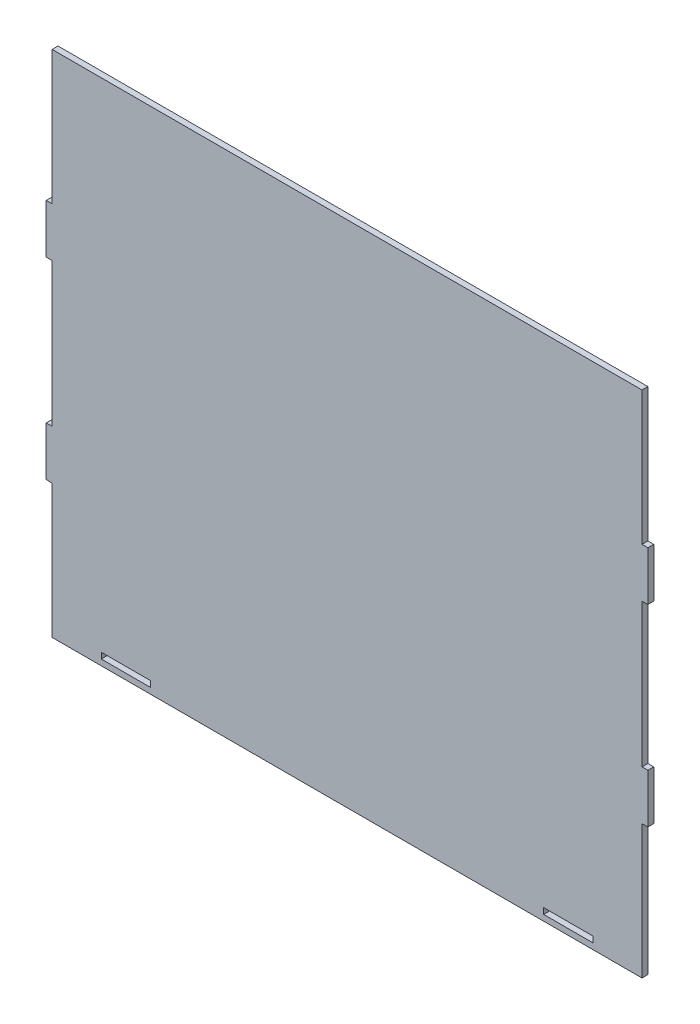
ISO-10303-21;
HEADER;
FILE_DESCRIPTION(('STEP AP214'),'2;1');
FILE_NAME('part.step','',(''),(''),'','','');
FILE_SCHEMA(('AUTOMOTIVE_DESIGN { 1 0 10303 214 1 1 1 1 }'));
ENDSEC;
DATA;
#1=APPLICATION_CONTEXT('core data for automotive mechanical design processes');
#2=APPLICATION_PROTOCOL_DEFINITION('international standard','automotive_design',2000,#1);
#3=PRODUCT_CONTEXT('',#1,'mechanical');
#4=PRODUCT('Part','Part','',(#3));
#5=PRODUCT_RELATED_PRODUCT_CATEGORY('part','',(#4));
#6=PRODUCT_DEFINITION_FORMATION('','',#4);
#7=PRODUCT_DEFINITION_CONTEXT('part definition',#1,'design');
#8=PRODUCT_DEFINITION('design','',#6,#7);
#9=PRODUCT_DEFINITION_SHAPE('','',#8);
#10=(LENGTH_UNIT() NAMED_UNIT(*) SI_UNIT(.MILLI.,.METRE.));
#11=(NAMED_UNIT(*) PLANE_ANGLE_UNIT() SI_UNIT($,.RADIAN.));
#12=(NAMED_UNIT(*) SI_UNIT($,.STERADIAN.) SOLID_ANGLE_UNIT());
#13=UNCERTAINTY_MEASURE_WITH_UNIT(LENGTH_MEASURE(1.E-05),#10,'distance_accuracy_value','');
#14=(GEOMETRIC_REPRESENTATION_CONTEXT(3) GLOBAL_UNCERTAINTY_ASSIGNED_CONTEXT((#13)) GLOBAL_UNIT_ASSIGNED_CONTEXT((#10,
#11,#12)) REPRESENTATION_CONTEXT('',''));
#15=CARTESIAN_POINT('',(0.,0.,0.));
#16=DIRECTION('',(0.,0.,1.));
#17=DIRECTION('',(1.,0.,0.));
#18=AXIS2_PLACEMENT_3D('',#15,#16,#17);
#19=CARTESIAN_POINT('',(0.,0.,6.));
#20=DIRECTION('',(0.,0.,1.));
#21=DIRECTION('',(1.,0.,0.));
#22=AXIS2_PLACEMENT_3D('',#19,#20,#21);
#23=PLANE('',#22);
#24=DIRECTION('',(0.,1.,0.));
#25=VECTOR('',#24,1.);
#26=CARTESIAN_POINT('',(300.,-123.,6.));
#27=LINE('',#26,#25);
#28=CARTESIAN_POINT('',(300.,-259.,6.));
#29=VERTEX_POINT('',#28);
#30=CARTESIAN_POINT('',(300.,-123.,6.));
#31=VERTEX_POINT('',#30);
#32=EDGE_CURVE('E285',#29,#31,#27,.T.);
#33=ORIENTED_EDGE('',*,*,#32,.T.);
#34=DIRECTION('',(1.,0.,0.));
#35=VECTOR('',#34,1.);
#36=CARTESIAN_POINT('',(306.,-123.,6.));
#37=LINE('',#36,#35);
#38=CARTESIAN_POINT('',(306.,-123.,6.));
#39=VERTEX_POINT('',#38);
#40=EDGE_CURVE('E288',#31,#39,#37,.T.);
#41=ORIENTED_EDGE('',*,*,#40,.T.);
#42=DIRECTION('',(0.,1.,0.));
#43=VECTOR('',#42,1.);
#44=CARTESIAN_POINT('',(306.,-123.,6.));
#45=LINE('',#44,#43);
#46=CARTESIAN_POINT('',(306.,-73.0000000000001,6.));
#47=VERTEX_POINT('',#46);
#48=EDGE_CURVE('E291',#39,#47,#45,.T.);
#49=ORIENTED_EDGE('',*,*,#48,.T.);
#50=DIRECTION('',(-1.,0.,0.));
#51=VECTOR('',#50,1.);
#52=CARTESIAN_POINT('',(306.,-73.0000000000001,6.));
#53=LINE('',#52,#51);
#54=CARTESIAN_POINT('',(300.,-73.0000000000002,6.));
#55=VERTEX_POINT('',#54);
#56=EDGE_CURVE('E293',#47,#55,#53,.T.);
#57=ORIENTED_EDGE('',*,*,#56,.T.);
#58=DIRECTION('',(0.,1.,0.));
#59=VECTOR('',#58,1.);
#60=CARTESIAN_POINT('',(300.,73.0000000000001,6.));
#61=LINE('',#60,#59);
#62=CARTESIAN_POINT('',(300.,73.0000000000001,6.));
#63=VERTEX_POINT('',#62);
#64=EDGE_CURVE('E295',#55,#63,#61,.T.);
#65=ORIENTED_EDGE('',*,*,#64,.T.);
#66=DIRECTION('',(1.,0.,0.));
#67=VECTOR('',#66,1.);
#68=CARTESIAN_POINT('',(306.,73.0000000000001,6.));
#69=LINE('',#68,#67);
#70=CARTESIAN_POINT('',(306.,73.0000000000001,6.));
#71=VERTEX_POINT('',#70);
#72=EDGE_CURVE('E297',#63,#71,#69,.T.);
#73=ORIENTED_EDGE('',*,*,#72,.T.);
#74=DIRECTION('',(0.,1.,0.));
#75=VECTOR('',#74,1.);
#76=CARTESIAN_POINT('',(306.,123.,6.));
#77=LINE('',#76,#75);
#78=CARTESIAN_POINT('',(306.,123.,6.));
#79=VERTEX_POINT('',#78);
#80=EDGE_CURVE('E299',#71,#79,#77,.T.);
#81=ORIENTED_EDGE('',*,*,#80,.T.);
#82=DIRECTION('',(-1.,0.,0.));
#83=VECTOR('',#82,1.);
#84=CARTESIAN_POINT('',(306.,123.,6.));
#85=LINE('',#84,#83);
#86=CARTESIAN_POINT('',(300.,123.,6.));
#87=VERTEX_POINT('',#86);
#88=EDGE_CURVE('E301',#79,#87,#85,.T.);
#89=ORIENTED_EDGE('',*,*,#88,.T.);
#90=DIRECTION('',(0.,1.,0.));
#91=VECTOR('',#90,1.);
#92=CARTESIAN_POINT('',(300.,259.,6.));
#93=LINE('',#92,#91);
#94=CARTESIAN_POINT('',(300.,259.,6.));
#95=VERTEX_POINT('',#94);
#96=EDGE_CURVE('E303',#87,#95,#93,.T.);
#97=ORIENTED_EDGE('',*,*,#96,.T.);
#98=DIRECTION('',(-1.,0.,0.));
#99=VECTOR('',#98,1.);
#100=CARTESIAN_POINT('',(-300.,259.,6.));
#101=LINE('',#100,#99);
#102=CARTESIAN_POINT('',(-300.,259.,6.));
#103=VERTEX_POINT('',#102);
#104=EDGE_CURVE('E305',#95,#103,#101,.T.);
#105=ORIENTED_EDGE('',*,*,#104,.T.);
#106=DIRECTION('',(0.,-1.,0.));
#107=VECTOR('',#106,1.);
#108=CARTESIAN_POINT('',(-300.,259.,6.));
#109=LINE('',#108,#107);
#110=CARTESIAN_POINT('',(-300.,123.,6.));
#111=VERTEX_POINT('',#110);
#112=EDGE_CURVE('E307',#103,#111,#109,.T.);
#113=ORIENTED_EDGE('',*,*,#112,.T.);
#114=DIRECTION('',(-1.,0.,0.));
#115=VECTOR('',#114,1.);
#116=CARTESIAN_POINT('',(-306.,123.,6.));
#117=LINE('',#116,#115);
#118=CARTESIAN_POINT('',(-306.,123.,6.));
#119=VERTEX_POINT('',#118);
#120=EDGE_CURVE('E309',#111,#119,#117,.T.);
#121=ORIENTED_EDGE('',*,*,#120,.T.);
#122=DIRECTION('',(0.,-1.,0.));
#123=VECTOR('',#122,1.);
#124=CARTESIAN_POINT('',(-306.,123.,6.));
#125=LINE('',#124,#123);
#126=CARTESIAN_POINT('',(-306.,73.0000000000001,6.));
#127=VERTEX_POINT('',#126);
#128=EDGE_CURVE('E311',#119,#127,#125,.T.);
#129=ORIENTED_EDGE('',*,*,#128,.T.);
#130=DIRECTION('',(1.,0.,0.));
#131=VECTOR('',#130,1.);
#132=CARTESIAN_POINT('',(-306.,73.0000000000001,6.));
#133=LINE('',#132,#131);
#134=CARTESIAN_POINT('',(-300.,73.0000000000001,6.));
#135=VERTEX_POINT('',#134);
#136=EDGE_CURVE('E313',#127,#135,#133,.T.);
#137=ORIENTED_EDGE('',*,*,#136,.T.);
#138=DIRECTION('',(0.,-1.,0.));
#139=VECTOR('',#138,1.);
#140=CARTESIAN_POINT('',(-300.,73.0000000000001,6.));
#141=LINE('',#140,#139);
#142=CARTESIAN_POINT('',(-300.,-73.0000000000002,6.));
#143=VERTEX_POINT('',#142);
#144=EDGE_CURVE('E315',#135,#143,#141,.T.);
#145=ORIENTED_EDGE('',*,*,#144,.T.);
#146=DIRECTION('',(-1.,0.,0.));
#147=VECTOR('',#146,1.);
#148=CARTESIAN_POINT('',(-306.,-73.0000000000002,6.));
#149=LINE('',#148,#147);
#150=CARTESIAN_POINT('',(-306.,-73.0000000000002,6.));
#151=VERTEX_POINT('',#150);
#152=EDGE_CURVE('E317',#143,#151,#149,.T.);
#153=ORIENTED_EDGE('',*,*,#152,.T.);
#154=DIRECTION('',(0.,-1.,0.));
#155=VECTOR('',#154,1.);
#156=CARTESIAN_POINT('',(-306.,-123.,6.));
#157=LINE('',#156,#155);
#158=CARTESIAN_POINT('',(-306.,-123.,6.));
#159=VERTEX_POINT('',#158);
#160=EDGE_CURVE('E319',#151,#159,#157,.T.);
#161=ORIENTED_EDGE('',*,*,#160,.T.);
#162=DIRECTION('',(1.,0.,0.));
#163=VECTOR('',#162,1.);
#164=CARTESIAN_POINT('',(-306.,-123.,6.));
#165=LINE('',#164,#163);
#166=CARTESIAN_POINT('',(-300.,-123.,6.));
#167=VERTEX_POINT('',#166);
#168=EDGE_CURVE('E321',#159,#167,#165,.T.);
#169=ORIENTED_EDGE('',*,*,#168,.T.);
#170=DIRECTION('',(0.,-1.,0.));
#171=VECTOR('',#170,1.);
#172=CARTESIAN_POINT('',(-300.,-123.,6.));
#173=LINE('',#172,#171);
#174=CARTESIAN_POINT('',(-300.,-259.,6.));
#175=VERTEX_POINT('',#174);
#176=EDGE_CURVE('E323',#167,#175,#173,.T.);
#177=ORIENTED_EDGE('',*,*,#176,.T.);
#178=DIRECTION('',(1.,0.,0.));
#179=VECTOR('',#178,1.);
#180=CARTESIAN_POINT('',(-300.,-259.,6.));
#181=LINE('',#180,#179);
#182=EDGE_CURVE('E325',#175,#29,#181,.T.);
#183=ORIENTED_EDGE('',*,*,#182,.T.);
#184=EDGE_LOOP('',(#33,#41,#49,#57,#65,#73,#81,#89,#97,#105,#113,#121,#129,#137,#145,#153,#161,
#169,#177,#183));
#185=FACE_BOUND('',#184,.T.);
#186=DIRECTION('',(-1.,0.,0.));
#187=VECTOR('',#186,1.);
#188=CARTESIAN_POINT('',(-250.,-247.,6.));
#189=LINE('',#188,#187);
#190=CARTESIAN_POINT('',(-200.,-247.,6.));
#191=VERTEX_POINT('',#190);
#192=CARTESIAN_POINT('',(-250.,-247.,6.));
#193=VERTEX_POINT('',#192);
#194=EDGE_CURVE('E256',#191,#193,#189,.T.);
#195=ORIENTED_EDGE('',*,*,#194,.F.);
#196=DIRECTION('',(0.,1.,0.));
#197=VECTOR('',#196,1.);
#198=CARTESIAN_POINT('',(-200.,-247.,6.));
#199=LINE('',#198,#197);
#200=CARTESIAN_POINT('',(-200.,-253.,6.));
#201=VERTEX_POINT('',#200);
#202=EDGE_CURVE('E254',#201,#191,#199,.T.);
#203=ORIENTED_EDGE('',*,*,#202,.F.);
#204=DIRECTION('',(1.,0.,0.));
#205=VECTOR('',#204,1.);
#206=CARTESIAN_POINT('',(-250.,-253.,6.));
#207=LINE('',#206,#205);
#208=CARTESIAN_POINT('',(-250.,-253.,6.));
#209=VERTEX_POINT('',#208);
#210=EDGE_CURVE('E262',#209,#201,#207,.T.);
#211=ORIENTED_EDGE('',*,*,#210,.F.);
#212=DIRECTION('',(0.,-1.,0.));
#213=VECTOR('',#212,1.);
#214=CARTESIAN_POINT('',(-250.,-247.,6.));
#215=LINE('',#214,#213);
#216=EDGE_CURVE('E259',#193,#209,#215,.T.);
#217=ORIENTED_EDGE('',*,*,#216,.F.);
#218=EDGE_LOOP('',(#195,#203,#211,#217));
#219=FACE_BOUND('',#218,.T.);
#220=DIRECTION('',(-1.,0.,0.));
#221=VECTOR('',#220,1.);
#222=CARTESIAN_POINT('',(250.,-247.,6.));
#223=LINE('',#222,#221);
#224=CARTESIAN_POINT('',(250.,-247.,6.));
#225=VERTEX_POINT('',#224);
#226=CARTESIAN_POINT('',(200.,-247.,6.));
#227=VERTEX_POINT('',#226);
#228=EDGE_CURVE('E226',#225,#227,#223,.T.);
#229=ORIENTED_EDGE('',*,*,#228,.F.);
#230=DIRECTION('',(0.,1.,0.));
#231=VECTOR('',#230,1.);
#232=CARTESIAN_POINT('',(250.,-247.,6.));
#233=LINE('',#232,#231);
#234=CARTESIAN_POINT('',(250.,-253.,6.));
#235=VERTEX_POINT('',#234);
#236=EDGE_CURVE('E218',#235,#225,#233,.T.);
#237=ORIENTED_EDGE('',*,*,#236,.F.);
#238=DIRECTION('',(1.,0.,0.));
#239=VECTOR('',#238,1.);
#240=CARTESIAN_POINT('',(250.,-253.,6.));
#241=LINE('',#240,#239);
#242=CARTESIAN_POINT('',(200.,-253.,6.));
#243=VERTEX_POINT('',#242);
#244=EDGE_CURVE('E240',#243,#235,#241,.T.);
#245=ORIENTED_EDGE('',*,*,#244,.F.);
#246=DIRECTION('',(0.,-1.,0.));
#247=VECTOR('',#246,1.);
#248=CARTESIAN_POINT('',(200.,-247.,6.));
#249=LINE('',#248,#247);
#250=EDGE_CURVE('E238',#227,#243,#249,.T.);
#251=ORIENTED_EDGE('',*,*,#250,.F.);
#252=EDGE_LOOP('',(#229,#237,#245,#251));
#253=FACE_BOUND('',#252,.T.);
#254=ADVANCED_FACE('F33',(#185,#219,#253),#23,.T.);
#255=CARTESIAN_POINT('',(0.,0.,0.));
#256=DIRECTION('',(0.,0.,1.));
#257=DIRECTION('',(1.,0.,0.));
#258=AXIS2_PLACEMENT_3D('',#255,#256,#257);
#259=PLANE('',#258);
#260=DIRECTION('',(0.,1.,0.));
#261=VECTOR('',#260,1.);
#262=CARTESIAN_POINT('',(-200.,-247.,0.));
#263=LINE('',#262,#261);
#264=CARTESIAN_POINT('',(-200.,-253.,0.));
#265=VERTEX_POINT('',#264);
#266=CARTESIAN_POINT('',(-200.,-247.,0.));
#267=VERTEX_POINT('',#266);
#268=EDGE_CURVE('E234',#265,#267,#263,.T.);
#269=ORIENTED_EDGE('',*,*,#268,.T.);
#270=DIRECTION('',(-1.,0.,0.));
#271=VECTOR('',#270,1.);
#272=CARTESIAN_POINT('',(-250.,-247.,0.));
#273=LINE('',#272,#271);
#274=CARTESIAN_POINT('',(-250.,-247.,0.));
#275=VERTEX_POINT('',#274);
#276=EDGE_CURVE('E267',#267,#275,#273,.T.);
#277=ORIENTED_EDGE('',*,*,#276,.T.);
#278=DIRECTION('',(0.,-1.,0.));
#279=VECTOR('',#278,1.);
#280=CARTESIAN_POINT('',(-250.,-247.,0.));
#281=LINE('',#280,#279);
#282=CARTESIAN_POINT('',(-250.,-253.,0.));
#283=VERTEX_POINT('',#282);
#284=EDGE_CURVE('E270',#275,#283,#281,.T.);
#285=ORIENTED_EDGE('',*,*,#284,.T.);
#286=DIRECTION('',(1.,0.,0.));
#287=VECTOR('',#286,1.);
#288=CARTESIAN_POINT('',(-250.,-253.,0.));
#289=LINE('',#288,#287);
#290=EDGE_CURVE('E257',#283,#265,#289,.T.);
#291=ORIENTED_EDGE('',*,*,#290,.T.);
#292=EDGE_LOOP('',(#269,#277,#285,#291));
#293=FACE_BOUND('',#292,.T.);
#294=DIRECTION('',(0.,1.,0.));
#295=VECTOR('',#294,1.);
#296=CARTESIAN_POINT('',(300.,-123.,0.));
#297=LINE('',#296,#295);
#298=CARTESIAN_POINT('',(300.,-259.,0.));
#299=VERTEX_POINT('',#298);
#300=CARTESIAN_POINT('',(300.,-123.,0.));
#301=VERTEX_POINT('',#300);
#302=EDGE_CURVE('E284',#299,#301,#297,.T.);
#303=ORIENTED_EDGE('',*,*,#302,.F.);
#304=DIRECTION('',(1.,0.,0.));
#305=VECTOR('',#304,1.);
#306=CARTESIAN_POINT('',(-300.,-259.,0.));
#307=LINE('',#306,#305);
#308=CARTESIAN_POINT('',(-300.,-259.,0.));
#309=VERTEX_POINT('',#308);
#310=EDGE_CURVE('E289',#309,#299,#307,.T.);
#311=ORIENTED_EDGE('',*,*,#310,.F.);
#312=DIRECTION('',(0.,-1.,0.));
#313=VECTOR('',#312,1.);
#314=CARTESIAN_POINT('',(-300.,-123.,0.));
#315=LINE('',#314,#313);
#316=CARTESIAN_POINT('',(-300.,-123.,0.));
#317=VERTEX_POINT('',#316);
#318=EDGE_CURVE('E364',#317,#309,#315,.T.);
#319=ORIENTED_EDGE('',*,*,#318,.F.);
#320=DIRECTION('',(1.,0.,0.));
#321=VECTOR('',#320,1.);
#322=CARTESIAN_POINT('',(-306.,-123.,0.));
#323=LINE('',#322,#321);
#324=CARTESIAN_POINT('',(-306.,-123.,0.));
#325=VERTEX_POINT('',#324);
#326=EDGE_CURVE('E362',#325,#317,#323,.T.);
#327=ORIENTED_EDGE('',*,*,#326,.F.);
#328=DIRECTION('',(0.,-1.,0.));
#329=VECTOR('',#328,1.);
#330=CARTESIAN_POINT('',(-306.,-123.,0.));
#331=LINE('',#330,#329);
#332=CARTESIAN_POINT('',(-306.,-73.0000000000002,0.));
#333=VERTEX_POINT('',#332);
#334=EDGE_CURVE('E360',#333,#325,#331,.T.);
#335=ORIENTED_EDGE('',*,*,#334,.F.);
#336=DIRECTION('',(-1.,0.,0.));
#337=VECTOR('',#336,1.);
#338=CARTESIAN_POINT('',(-306.,-73.0000000000002,0.));
#339=LINE('',#338,#337);
#340=CARTESIAN_POINT('',(-300.,-73.0000000000002,0.));
#341=VERTEX_POINT('',#340);
#342=EDGE_CURVE('E358',#341,#333,#339,.T.);
#343=ORIENTED_EDGE('',*,*,#342,.F.);
#344=DIRECTION('',(0.,-1.,0.));
#345=VECTOR('',#344,1.);
#346=CARTESIAN_POINT('',(-300.,73.0000000000001,0.));
#347=LINE('',#346,#345);
#348=CARTESIAN_POINT('',(-300.,73.0000000000001,0.));
#349=VERTEX_POINT('',#348);
#350=EDGE_CURVE('E356',#349,#341,#347,.T.);
#351=ORIENTED_EDGE('',*,*,#350,.F.);
#352=DIRECTION('',(1.,0.,0.));
#353=VECTOR('',#352,1.);
#354=CARTESIAN_POINT('',(-306.,73.0000000000001,0.));
#355=LINE('',#354,#353);
#356=CARTESIAN_POINT('',(-306.,73.0000000000001,0.));
#357=VERTEX_POINT('',#356);
#358=EDGE_CURVE('E354',#357,#349,#355,.T.);
#359=ORIENTED_EDGE('',*,*,#358,.F.);
#360=DIRECTION('',(0.,-1.,0.));
#361=VECTOR('',#360,1.);
#362=CARTESIAN_POINT('',(-306.,123.,0.));
#363=LINE('',#362,#361);
#364=CARTESIAN_POINT('',(-306.,123.,0.));
#365=VERTEX_POINT('',#364);
#366=EDGE_CURVE('E352',#365,#357,#363,.T.);
#367=ORIENTED_EDGE('',*,*,#366,.F.);
#368=DIRECTION('',(-1.,0.,0.));
#369=VECTOR('',#368,1.);
#370=CARTESIAN_POINT('',(-306.,123.,0.));
#371=LINE('',#370,#369);
#372=CARTESIAN_POINT('',(-300.,123.,0.));
#373=VERTEX_POINT('',#372);
#374=EDGE_CURVE('E350',#373,#365,#371,.T.);
#375=ORIENTED_EDGE('',*,*,#374,.F.);
#376=DIRECTION('',(0.,-1.,0.));
#377=VECTOR('',#376,1.);
#378=CARTESIAN_POINT('',(-300.,259.,0.));
#379=LINE('',#378,#377);
#380=CARTESIAN_POINT('',(-300.,259.,0.));
#381=VERTEX_POINT('',#380);
#382=EDGE_CURVE('E348',#381,#373,#379,.T.);
#383=ORIENTED_EDGE('',*,*,#382,.F.);
#384=DIRECTION('',(-1.,0.,0.));
#385=VECTOR('',#384,1.);
#386=CARTESIAN_POINT('',(-300.,259.,0.));
#387=LINE('',#386,#385);
#388=CARTESIAN_POINT('',(300.,259.,0.));
#389=VERTEX_POINT('',#388);
#390=EDGE_CURVE('E346',#389,#381,#387,.T.);
#391=ORIENTED_EDGE('',*,*,#390,.F.);
#392=DIRECTION('',(0.,1.,0.));
#393=VECTOR('',#392,1.);
#394=CARTESIAN_POINT('',(300.,259.,0.));
#395=LINE('',#394,#393);
#396=CARTESIAN_POINT('',(300.,123.,0.));
#397=VERTEX_POINT('',#396);
#398=EDGE_CURVE('E344',#397,#389,#395,.T.);
#399=ORIENTED_EDGE('',*,*,#398,.F.);
#400=DIRECTION('',(-1.,0.,0.));
#401=VECTOR('',#400,1.);
#402=CARTESIAN_POINT('',(306.,123.,0.));
#403=LINE('',#402,#401);
#404=CARTESIAN_POINT('',(306.,123.,0.));
#405=VERTEX_POINT('',#404);
#406=EDGE_CURVE('E342',#405,#397,#403,.T.);
#407=ORIENTED_EDGE('',*,*,#406,.F.);
#408=DIRECTION('',(0.,1.,0.));
#409=VECTOR('',#408,1.);
#410=CARTESIAN_POINT('',(306.,123.,0.));
#411=LINE('',#410,#409);
#412=CARTESIAN_POINT('',(306.,73.0000000000001,0.));
#413=VERTEX_POINT('',#412);
#414=EDGE_CURVE('E340',#413,#405,#411,.T.);
#415=ORIENTED_EDGE('',*,*,#414,.F.);
#416=DIRECTION('',(1.,0.,0.));
#417=VECTOR('',#416,1.);
#418=CARTESIAN_POINT('',(306.,73.0000000000001,0.));
#419=LINE('',#418,#417);
#420=CARTESIAN_POINT('',(300.,73.0000000000001,0.));
#421=VERTEX_POINT('',#420);
#422=EDGE_CURVE('E338',#421,#413,#419,.T.);
#423=ORIENTED_EDGE('',*,*,#422,.F.);
#424=DIRECTION('',(0.,1.,0.));
#425=VECTOR('',#424,1.);
#426=CARTESIAN_POINT('',(300.,73.0000000000001,0.));
#427=LINE('',#426,#425);
#428=CARTESIAN_POINT('',(300.,-73.0000000000002,0.));
#429=VERTEX_POINT('',#428);
#430=EDGE_CURVE('E336',#429,#421,#427,.T.);
#431=ORIENTED_EDGE('',*,*,#430,.F.);
#432=DIRECTION('',(-1.,0.,0.));
#433=VECTOR('',#432,1.);
#434=CARTESIAN_POINT('',(306.,-73.0000000000001,0.));
#435=LINE('',#434,#433);
#436=CARTESIAN_POINT('',(306.,-73.0000000000001,0.));
#437=VERTEX_POINT('',#436);
#438=EDGE_CURVE('E334',#437,#429,#435,.T.);
#439=ORIENTED_EDGE('',*,*,#438,.F.);
#440=DIRECTION('',(0.,1.,0.));
#441=VECTOR('',#440,1.);
#442=CARTESIAN_POINT('',(306.,-123.,0.));
#443=LINE('',#442,#441);
#444=CARTESIAN_POINT('',(306.,-123.,0.));
#445=VERTEX_POINT('',#444);
#446=EDGE_CURVE('E332',#445,#437,#443,.T.);
#447=ORIENTED_EDGE('',*,*,#446,.F.);
#448=DIRECTION('',(1.,0.,0.));
#449=VECTOR('',#448,1.);
#450=CARTESIAN_POINT('',(306.,-123.,0.));
#451=LINE('',#450,#449);
#452=EDGE_CURVE('E330',#301,#445,#451,.T.);
#453=ORIENTED_EDGE('',*,*,#452,.F.);
#454=EDGE_LOOP('',(#303,#311,#319,#327,#335,#343,#351,#359,#367,#375,#383,#391,#399,#407,#415,
#423,#431,#439,#447,#453));
#455=FACE_BOUND('',#454,.T.);
#456=DIRECTION('',(0.,1.,0.));
#457=VECTOR('',#456,1.);
#458=CARTESIAN_POINT('',(250.,-247.,0.));
#459=LINE('',#458,#457);
#460=CARTESIAN_POINT('',(250.,-253.,0.));
#461=VERTEX_POINT('',#460);
#462=CARTESIAN_POINT('',(250.,-247.,0.));
#463=VERTEX_POINT('',#462);
#464=EDGE_CURVE('E56',#461,#463,#459,.T.);
#465=ORIENTED_EDGE('',*,*,#464,.T.);
#466=DIRECTION('',(-1.,0.,0.));
#467=VECTOR('',#466,1.);
#468=CARTESIAN_POINT('',(250.,-247.,0.));
#469=LINE('',#468,#467);
#470=CARTESIAN_POINT('',(200.,-247.,0.));
#471=VERTEX_POINT('',#470);
#472=EDGE_CURVE('E233',#463,#471,#469,.T.);
#473=ORIENTED_EDGE('',*,*,#472,.T.);
#474=DIRECTION('',(0.,-1.,0.));
#475=VECTOR('',#474,1.);
#476=CARTESIAN_POINT('',(200.,-247.,0.));
#477=LINE('',#476,#475);
#478=CARTESIAN_POINT('',(200.,-253.,0.));
#479=VERTEX_POINT('',#478);
#480=EDGE_CURVE('E246',#471,#479,#477,.T.);
#481=ORIENTED_EDGE('',*,*,#480,.T.);
#482=DIRECTION('',(1.,0.,0.));
#483=VECTOR('',#482,1.);
#484=CARTESIAN_POINT('',(250.,-253.,0.));
#485=LINE('',#484,#483);
#486=EDGE_CURVE('E227',#479,#461,#485,.T.);
#487=ORIENTED_EDGE('',*,*,#486,.T.);
#488=EDGE_LOOP('',(#465,#473,#481,#487));
#489=FACE_BOUND('',#488,.T.);
#490=ADVANCED_FACE('F430',(#293,#455,#489),#259,.F.);
#491=CARTESIAN_POINT('',(300.,-123.,6.));
#492=DIRECTION('',(-1.,0.,0.));
#493=DIRECTION('',(0.,-1.,0.));
#494=AXIS2_PLACEMENT_3D('',#491,#492,#493);
#495=PLANE('',#494);
#496=ORIENTED_EDGE('',*,*,#302,.T.);
#497=DIRECTION('',(0.,0.,-1.));
#498=VECTOR('',#497,1.);
#499=CARTESIAN_POINT('',(300.,-123.,6.));
#500=LINE('',#499,#498);
#501=EDGE_CURVE('E11',#31,#301,#500,.T.);
#502=ORIENTED_EDGE('',*,*,#501,.F.);
#503=ORIENTED_EDGE('',*,*,#32,.F.);
#504=DIRECTION('',(0.,0.,-1.));
#505=VECTOR('',#504,1.);
#506=CARTESIAN_POINT('',(300.,-259.,6.));
#507=LINE('',#506,#505);
#508=EDGE_CURVE('E327',#29,#299,#507,.T.);
#509=ORIENTED_EDGE('',*,*,#508,.T.);
#510=EDGE_LOOP('',(#496,#502,#503,#509));
#511=FACE_BOUND('',#510,.T.);
#512=ADVANCED_FACE('F35',(#511),#495,.F.);
#513=CARTESIAN_POINT('',(306.,-123.,6.));
#514=DIRECTION('',(0.,1.,0.));
#515=DIRECTION('',(-1.,0.,0.));
#516=AXIS2_PLACEMENT_3D('',#513,#514,#515);
#517=PLANE('',#516);
#518=ORIENTED_EDGE('',*,*,#452,.T.);
#519=DIRECTION('',(0.,0.,-1.));
#520=VECTOR('',#519,1.);
#521=CARTESIAN_POINT('',(306.,-123.,6.));
#522=LINE('',#521,#520);
#523=EDGE_CURVE('E41',#39,#445,#522,.T.);
#524=ORIENTED_EDGE('',*,*,#523,.F.);
#525=ORIENTED_EDGE('',*,*,#40,.F.);
#526=ORIENTED_EDGE('',*,*,#501,.T.);
#527=EDGE_LOOP('',(#518,#524,#525,#526));
#528=FACE_BOUND('',#527,.T.);
#529=ADVANCED_FACE('F448',(#528),#517,.F.);
#530=CARTESIAN_POINT('',(306.,-123.,6.));
#531=DIRECTION('',(-1.,0.,0.));
#532=DIRECTION('',(0.,0.,1.));
#533=AXIS2_PLACEMENT_3D('',#530,#531,#532);
#534=PLANE('',#533);
#535=ORIENTED_EDGE('',*,*,#446,.T.);
#536=DIRECTION('',(0.,0.,-1.));
#537=VECTOR('',#536,1.);
#538=CARTESIAN_POINT('',(306.,-73.0000000000001,6.));
#539=LINE('',#538,#537);
#540=EDGE_CURVE('E417',#47,#437,#539,.T.);
#541=ORIENTED_EDGE('',*,*,#540,.F.);
#542=ORIENTED_EDGE('',*,*,#48,.F.);
#543=ORIENTED_EDGE('',*,*,#523,.T.);
#544=EDGE_LOOP('',(#535,#541,#542,#543));
#545=FACE_BOUND('',#544,.T.);
#546=ADVANCED_FACE('F424',(#545),#534,.F.);
#547=CARTESIAN_POINT('',(306.,-73.0000000000001,6.));
#548=DIRECTION('',(0.,-1.,0.));
#549=DIRECTION('',(1.,0.,0.));
#550=AXIS2_PLACEMENT_3D('',#547,#548,#549);
#551=PLANE('',#550);
#552=ORIENTED_EDGE('',*,*,#438,.T.);
#553=DIRECTION('',(0.,0.,-1.));
#554=VECTOR('',#553,1.);
#555=CARTESIAN_POINT('',(300.,-73.0000000000002,6.));
#556=LINE('',#555,#554);
#557=EDGE_CURVE('E414',#55,#429,#556,.T.);
#558=ORIENTED_EDGE('',*,*,#557,.F.);
#559=ORIENTED_EDGE('',*,*,#56,.F.);
#560=ORIENTED_EDGE('',*,*,#540,.T.);
#561=EDGE_LOOP('',(#552,#558,#559,#560));
#562=FACE_BOUND('',#561,.T.);
#563=ADVANCED_FACE('F436',(#562),#551,.F.);
#564=CARTESIAN_POINT('',(300.,73.0000000000001,6.));
#565=DIRECTION('',(-1.,0.,0.));
#566=DIRECTION('',(0.,0.,1.));
#567=AXIS2_PLACEMENT_3D('',#564,#565,#566);
#568=PLANE('',#567);
#569=ORIENTED_EDGE('',*,*,#430,.T.);
#570=DIRECTION('',(0.,0.,-1.));
#571=VECTOR('',#570,1.);
#572=CARTESIAN_POINT('',(300.,73.0000000000001,6.));
#573=LINE('',#572,#571);
#574=EDGE_CURVE('E411',#63,#421,#573,.T.);
#575=ORIENTED_EDGE('',*,*,#574,.F.);
#576=ORIENTED_EDGE('',*,*,#64,.F.);
#577=ORIENTED_EDGE('',*,*,#557,.T.);
#578=EDGE_LOOP('',(#569,#575,#576,#577));
#579=FACE_BOUND('',#578,.T.);
#580=ADVANCED_FACE('F440',(#579),#568,.F.);
#581=CARTESIAN_POINT('',(306.,73.0000000000001,6.));
#582=DIRECTION('',(0.,1.,0.));
#583=DIRECTION('',(-1.,0.,0.));
#584=AXIS2_PLACEMENT_3D('',#581,#582,#583);
#585=PLANE('',#584);
#586=ORIENTED_EDGE('',*,*,#422,.T.);
#587=DIRECTION('',(0.,0.,-1.));
#588=VECTOR('',#587,1.);
#589=CARTESIAN_POINT('',(306.,73.0000000000001,6.));
#590=LINE('',#589,#588);
#591=EDGE_CURVE('E408',#71,#413,#590,.T.);
#592=ORIENTED_EDGE('',*,*,#591,.F.);
#593=ORIENTED_EDGE('',*,*,#72,.F.);
#594=ORIENTED_EDGE('',*,*,#574,.T.);
#595=EDGE_LOOP('',(#586,#592,#593,#594));
#596=FACE_BOUND('',#595,.T.);
#597=ADVANCED_FACE('F521',(#596),#585,.F.);
#598=CARTESIAN_POINT('',(306.,123.,6.));
#599=DIRECTION('',(-1.,0.,0.));
#600=DIRECTION('',(0.,0.,1.));
#601=AXIS2_PLACEMENT_3D('',#598,#599,#600);
#602=PLANE('',#601);
#603=ORIENTED_EDGE('',*,*,#414,.T.);
#604=DIRECTION('',(0.,0.,-1.));
#605=VECTOR('',#604,1.);
#606=CARTESIAN_POINT('',(306.,123.,6.));
#607=LINE('',#606,#605);
#608=EDGE_CURVE('E405',#79,#405,#607,.T.);
#609=ORIENTED_EDGE('',*,*,#608,.F.);
#610=ORIENTED_EDGE('',*,*,#80,.F.);
#611=ORIENTED_EDGE('',*,*,#591,.T.);
#612=EDGE_LOOP('',(#603,#609,#610,#611));
#613=FACE_BOUND('',#612,.T.);
#614=ADVANCED_FACE('F519',(#613),#602,.F.);
#615=CARTESIAN_POINT('',(306.,123.,6.));
#616=DIRECTION('',(0.,-1.,0.));
#617=DIRECTION('',(1.,0.,0.));
#618=AXIS2_PLACEMENT_3D('',#615,#616,#617);
#619=PLANE('',#618);
#620=ORIENTED_EDGE('',*,*,#406,.T.);
#621=DIRECTION('',(0.,0.,-1.));
#622=VECTOR('',#621,1.);
#623=CARTESIAN_POINT('',(300.,123.,6.));
#624=LINE('',#623,#622);
#625=EDGE_CURVE('E402',#87,#397,#624,.T.);
#626=ORIENTED_EDGE('',*,*,#625,.F.);
#627=ORIENTED_EDGE('',*,*,#88,.F.);
#628=ORIENTED_EDGE('',*,*,#608,.T.);
#629=EDGE_LOOP('',(#620,#626,#627,#628));
#630=FACE_BOUND('',#629,.T.);
#631=ADVANCED_FACE('F514',(#630),#619,.F.);
#632=CARTESIAN_POINT('',(300.,259.,6.));
#633=DIRECTION('',(-1.,0.,0.));
#634=DIRECTION('',(0.,0.,1.));
#635=AXIS2_PLACEMENT_3D('',#632,#633,#634);
#636=PLANE('',#635);
#637=ORIENTED_EDGE('',*,*,#398,.T.);
#638=DIRECTION('',(0.,0.,-1.));
#639=VECTOR('',#638,1.);
#640=CARTESIAN_POINT('',(300.,259.,6.));
#641=LINE('',#640,#639);
#642=EDGE_CURVE('E399',#95,#389,#641,.T.);
#643=ORIENTED_EDGE('',*,*,#642,.F.);
#644=ORIENTED_EDGE('',*,*,#96,.F.);
#645=ORIENTED_EDGE('',*,*,#625,.T.);
#646=EDGE_LOOP('',(#637,#643,#644,#645));
#647=FACE_BOUND('',#646,.T.);
#648=ADVANCED_FACE('F509',(#647),#636,.F.);
#649=CARTESIAN_POINT('',(-300.,259.,6.));
#650=DIRECTION('',(0.,-1.,0.));
#651=DIRECTION('',(1.,0.,0.));
#652=AXIS2_PLACEMENT_3D('',#649,#650,#651);
#653=PLANE('',#652);
#654=ORIENTED_EDGE('',*,*,#390,.T.);
#655=DIRECTION('',(0.,0.,-1.));
#656=VECTOR('',#655,1.);
#657=CARTESIAN_POINT('',(-300.,259.,6.));
#658=LINE('',#657,#656);
#659=EDGE_CURVE('E396',#103,#381,#658,.T.);
#660=ORIENTED_EDGE('',*,*,#659,.F.);
#661=ORIENTED_EDGE('',*,*,#104,.F.);
#662=ORIENTED_EDGE('',*,*,#642,.T.);
#663=EDGE_LOOP('',(#654,#660,#661,#662));
#664=FACE_BOUND('',#663,.T.);
#665=ADVANCED_FACE('F505',(#664),#653,.F.);
#666=CARTESIAN_POINT('',(-300.,259.,6.));
#667=DIRECTION('',(1.,0.,0.));
#668=DIRECTION('',(0.,1.,0.));
#669=AXIS2_PLACEMENT_3D('',#666,#667,#668);
#670=PLANE('',#669);
#671=ORIENTED_EDGE('',*,*,#382,.T.);
#672=DIRECTION('',(0.,0.,-1.));
#673=VECTOR('',#672,1.);
#674=CARTESIAN_POINT('',(-300.,123.,6.));
#675=LINE('',#674,#673);
#676=EDGE_CURVE('E393',#111,#373,#675,.T.);
#677=ORIENTED_EDGE('',*,*,#676,.F.);
#678=ORIENTED_EDGE('',*,*,#112,.F.);
#679=ORIENTED_EDGE('',*,*,#659,.T.);
#680=EDGE_LOOP('',(#671,#677,#678,#679));
#681=FACE_BOUND('',#680,.T.);
#682=ADVANCED_FACE('F500',(#681),#670,.F.);
#683=CARTESIAN_POINT('',(-306.,123.,6.));
#684=DIRECTION('',(0.,-1.,0.));
#685=DIRECTION('',(0.,0.,-1.));
#686=AXIS2_PLACEMENT_3D('',#683,#684,#685);
#687=PLANE('',#686);
#688=ORIENTED_EDGE('',*,*,#374,.T.);
#689=DIRECTION('',(0.,0.,-1.));
#690=VECTOR('',#689,1.);
#691=CARTESIAN_POINT('',(-306.,123.,6.));
#692=LINE('',#691,#690);
#693=EDGE_CURVE('E390',#119,#365,#692,.T.);
#694=ORIENTED_EDGE('',*,*,#693,.F.);
#695=ORIENTED_EDGE('',*,*,#120,.F.);
#696=ORIENTED_EDGE('',*,*,#676,.T.);
#697=EDGE_LOOP('',(#688,#694,#695,#696));
#698=FACE_BOUND('',#697,.T.);
#699=ADVANCED_FACE('F494',(#698),#687,.F.);
#700=CARTESIAN_POINT('',(-306.,123.,6.));
#701=DIRECTION('',(1.,0.,0.));
#702=DIRECTION('',(0.,0.,-1.));
#703=AXIS2_PLACEMENT_3D('',#700,#701,#702);
#704=PLANE('',#703);
#705=ORIENTED_EDGE('',*,*,#366,.T.);
#706=DIRECTION('',(0.,0.,-1.));
#707=VECTOR('',#706,1.);
#708=CARTESIAN_POINT('',(-306.,73.0000000000001,6.));
#709=LINE('',#708,#707);
#710=EDGE_CURVE('E387',#127,#357,#709,.T.);
#711=ORIENTED_EDGE('',*,*,#710,.F.);
#712=ORIENTED_EDGE('',*,*,#128,.F.);
#713=ORIENTED_EDGE('',*,*,#693,.T.);
#714=EDGE_LOOP('',(#705,#711,#712,#713));
#715=FACE_BOUND('',#714,.T.);
#716=ADVANCED_FACE('F490',(#715),#704,.F.);
#717=CARTESIAN_POINT('',(-306.,73.0000000000001,6.));
#718=DIRECTION('',(0.,1.,0.));
#719=DIRECTION('',(0.,0.,1.));
#720=AXIS2_PLACEMENT_3D('',#717,#718,#719);
#721=PLANE('',#720);
#722=ORIENTED_EDGE('',*,*,#358,.T.);
#723=DIRECTION('',(0.,0.,-1.));
#724=VECTOR('',#723,1.);
#725=CARTESIAN_POINT('',(-300.,73.0000000000001,6.));
#726=LINE('',#725,#724);
#727=EDGE_CURVE('E384',#135,#349,#726,.T.);
#728=ORIENTED_EDGE('',*,*,#727,.F.);
#729=ORIENTED_EDGE('',*,*,#136,.F.);
#730=ORIENTED_EDGE('',*,*,#710,.T.);
#731=EDGE_LOOP('',(#722,#728,#729,#730));
#732=FACE_BOUND('',#731,.T.);
#733=ADVANCED_FACE('F485',(#732),#721,.F.);
#734=CARTESIAN_POINT('',(-300.,73.0000000000001,6.));
#735=DIRECTION('',(1.,0.,0.));
#736=DIRECTION('',(0.,0.,-1.));
#737=AXIS2_PLACEMENT_3D('',#734,#735,#736);
#738=PLANE('',#737);
#739=ORIENTED_EDGE('',*,*,#350,.T.);
#740=DIRECTION('',(0.,0.,-1.));
#741=VECTOR('',#740,1.);
#742=CARTESIAN_POINT('',(-300.,-73.0000000000002,6.));
#743=LINE('',#742,#741);
#744=EDGE_CURVE('E381',#143,#341,#743,.T.);
#745=ORIENTED_EDGE('',*,*,#744,.F.);
#746=ORIENTED_EDGE('',*,*,#144,.F.);
#747=ORIENTED_EDGE('',*,*,#727,.T.);
#748=EDGE_LOOP('',(#739,#745,#746,#747));
#749=FACE_BOUND('',#748,.T.);
#750=ADVANCED_FACE('F479',(#749),#738,.F.);
#751=CARTESIAN_POINT('',(-306.,-73.0000000000002,6.));
#752=DIRECTION('',(0.,-1.,0.));
#753=DIRECTION('',(1.,0.,0.));
#754=AXIS2_PLACEMENT_3D('',#751,#752,#753);
#755=PLANE('',#754);
#756=ORIENTED_EDGE('',*,*,#342,.T.);
#757=DIRECTION('',(0.,0.,-1.));
#758=VECTOR('',#757,1.);
#759=CARTESIAN_POINT('',(-306.,-73.0000000000002,6.));
#760=LINE('',#759,#758);
#761=EDGE_CURVE('E378',#151,#333,#760,.T.);
#762=ORIENTED_EDGE('',*,*,#761,.F.);
#763=ORIENTED_EDGE('',*,*,#152,.F.);
#764=ORIENTED_EDGE('',*,*,#744,.T.);
#765=EDGE_LOOP('',(#756,#762,#763,#764));
#766=FACE_BOUND('',#765,.T.);
#767=ADVANCED_FACE('F475',(#766),#755,.F.);
#768=CARTESIAN_POINT('',(-306.,-123.,6.));
#769=DIRECTION('',(1.,0.,0.));
#770=DIRECTION('',(0.,0.,-1.));
#771=AXIS2_PLACEMENT_3D('',#768,#769,#770);
#772=PLANE('',#771);
#773=ORIENTED_EDGE('',*,*,#334,.T.);
#774=DIRECTION('',(0.,0.,-1.));
#775=VECTOR('',#774,1.);
#776=CARTESIAN_POINT('',(-306.,-123.,6.));
#777=LINE('',#776,#775);
#778=EDGE_CURVE('E375',#159,#325,#777,.T.);
#779=ORIENTED_EDGE('',*,*,#778,.F.);
#780=ORIENTED_EDGE('',*,*,#160,.F.);
#781=ORIENTED_EDGE('',*,*,#761,.T.);
#782=EDGE_LOOP('',(#773,#779,#780,#781));
#783=FACE_BOUND('',#782,.T.);
#784=ADVANCED_FACE('F470',(#783),#772,.F.);
#785=CARTESIAN_POINT('',(-306.,-123.,6.));
#786=DIRECTION('',(0.,1.,0.));
#787=DIRECTION('',(-1.,0.,0.));
#788=AXIS2_PLACEMENT_3D('',#785,#786,#787);
#789=PLANE('',#788);
#790=ORIENTED_EDGE('',*,*,#326,.T.);
#791=DIRECTION('',(0.,0.,-1.));
#792=VECTOR('',#791,1.);
#793=CARTESIAN_POINT('',(-300.,-123.,6.));
#794=LINE('',#793,#792);
#795=EDGE_CURVE('E372',#167,#317,#794,.T.);
#796=ORIENTED_EDGE('',*,*,#795,.F.);
#797=ORIENTED_EDGE('',*,*,#168,.F.);
#798=ORIENTED_EDGE('',*,*,#778,.T.);
#799=EDGE_LOOP('',(#790,#796,#797,#798));
#800=FACE_BOUND('',#799,.T.);
#801=ADVANCED_FACE('F464',(#800),#789,.F.);
#802=CARTESIAN_POINT('',(-300.,-123.,6.));
#803=DIRECTION('',(1.,0.,0.));
#804=DIRECTION('',(0.,1.,0.));
#805=AXIS2_PLACEMENT_3D('',#802,#803,#804);
#806=PLANE('',#805);
#807=ORIENTED_EDGE('',*,*,#318,.T.);
#808=DIRECTION('',(0.,0.,-1.));
#809=VECTOR('',#808,1.);
#810=CARTESIAN_POINT('',(-300.,-259.,6.));
#811=LINE('',#810,#809);
#812=EDGE_CURVE('E369',#175,#309,#811,.T.);
#813=ORIENTED_EDGE('',*,*,#812,.F.);
#814=ORIENTED_EDGE('',*,*,#176,.F.);
#815=ORIENTED_EDGE('',*,*,#795,.T.);
#816=EDGE_LOOP('',(#807,#813,#814,#815));
#817=FACE_BOUND('',#816,.T.);
#818=ADVANCED_FACE('F460',(#817),#806,.F.);
#819=CARTESIAN_POINT('',(-300.,-259.,6.));
#820=DIRECTION('',(0.,1.,0.));
#821=DIRECTION('',(-1.,0.,0.));
#822=AXIS2_PLACEMENT_3D('',#819,#820,#821);
#823=PLANE('',#822);
#824=ORIENTED_EDGE('',*,*,#310,.T.);
#825=ORIENTED_EDGE('',*,*,#508,.F.);
#826=ORIENTED_EDGE('',*,*,#182,.F.);
#827=ORIENTED_EDGE('',*,*,#812,.T.);
#828=EDGE_LOOP('',(#824,#825,#826,#827));
#829=FACE_BOUND('',#828,.T.);
#830=ADVANCED_FACE('F455',(#829),#823,.F.);
#831=CARTESIAN_POINT('',(-200.,-247.,6.));
#832=DIRECTION('',(-1.,0.,0.));
#833=DIRECTION('',(0.,0.,1.));
#834=AXIS2_PLACEMENT_3D('',#831,#832,#833);
#835=PLANE('',#834);
#836=ORIENTED_EDGE('',*,*,#268,.F.);
#837=DIRECTION('',(0.,0.,-1.));
#838=VECTOR('',#837,1.);
#839=CARTESIAN_POINT('',(-200.,-253.,6.));
#840=LINE('',#839,#838);
#841=EDGE_CURVE('E264',#201,#265,#840,.T.);
#842=ORIENTED_EDGE('',*,*,#841,.F.);
#843=ORIENTED_EDGE('',*,*,#202,.T.);
#844=DIRECTION('',(0.,0.,-1.));
#845=VECTOR('',#844,1.);
#846=CARTESIAN_POINT('',(-200.,-247.,6.));
#847=LINE('',#846,#845);
#848=EDGE_CURVE('E281',#191,#267,#847,.T.);
#849=ORIENTED_EDGE('',*,*,#848,.T.);
#850=EDGE_LOOP('',(#836,#842,#843,#849));
#851=FACE_BOUND('',#850,.T.);
#852=ADVANCED_FACE('F538',(#851),#835,.T.);
#853=CARTESIAN_POINT('',(-250.,-247.,6.));
#854=DIRECTION('',(0.,-1.,0.));
#855=DIRECTION('',(1.,0.,0.));
#856=AXIS2_PLACEMENT_3D('',#853,#854,#855);
#857=PLANE('',#856);
#858=ORIENTED_EDGE('',*,*,#276,.F.);
#859=ORIENTED_EDGE('',*,*,#848,.F.);
#860=ORIENTED_EDGE('',*,*,#194,.T.);
#861=DIRECTION('',(0.,0.,-1.));
#862=VECTOR('',#861,1.);
#863=CARTESIAN_POINT('',(-250.,-247.,6.));
#864=LINE('',#863,#862);
#865=EDGE_CURVE('E279',#193,#275,#864,.T.);
#866=ORIENTED_EDGE('',*,*,#865,.T.);
#867=EDGE_LOOP('',(#858,#859,#860,#866));
#868=FACE_BOUND('',#867,.T.);
#869=ADVANCED_FACE('F624',(#868),#857,.T.);
#870=CARTESIAN_POINT('',(-250.,-247.,6.));
#871=DIRECTION('',(1.,0.,0.));
#872=DIRECTION('',(0.,0.,-1.));
#873=AXIS2_PLACEMENT_3D('',#870,#871,#872);
#874=PLANE('',#873);
#875=ORIENTED_EDGE('',*,*,#284,.F.);
#876=ORIENTED_EDGE('',*,*,#865,.F.);
#877=ORIENTED_EDGE('',*,*,#216,.T.);
#878=DIRECTION('',(0.,0.,-1.));
#879=VECTOR('',#878,1.);
#880=CARTESIAN_POINT('',(-250.,-253.,6.));
#881=LINE('',#880,#879);
#882=EDGE_CURVE('E277',#209,#283,#881,.T.);
#883=ORIENTED_EDGE('',*,*,#882,.T.);
#884=EDGE_LOOP('',(#875,#876,#877,#883));
#885=FACE_BOUND('',#884,.T.);
#886=ADVANCED_FACE('F631',(#885),#874,.T.);
#887=CARTESIAN_POINT('',(-250.,-253.,6.));
#888=DIRECTION('',(0.,1.,0.));
#889=DIRECTION('',(0.,0.,1.));
#890=AXIS2_PLACEMENT_3D('',#887,#888,#889);
#891=PLANE('',#890);
#892=ORIENTED_EDGE('',*,*,#290,.F.);
#893=ORIENTED_EDGE('',*,*,#882,.F.);
#894=ORIENTED_EDGE('',*,*,#210,.T.);
#895=ORIENTED_EDGE('',*,*,#841,.T.);
#896=EDGE_LOOP('',(#892,#893,#894,#895));
#897=FACE_BOUND('',#896,.T.);
#898=ADVANCED_FACE('F638',(#897),#891,.T.);
#899=CARTESIAN_POINT('',(250.,-247.,6.));
#900=DIRECTION('',(-1.,0.,0.));
#901=DIRECTION('',(0.,0.,1.));
#902=AXIS2_PLACEMENT_3D('',#899,#900,#901);
#903=PLANE('',#902);
#904=ORIENTED_EDGE('',*,*,#464,.F.);
#905=DIRECTION('',(0.,0.,-1.));
#906=VECTOR('',#905,1.);
#907=CARTESIAN_POINT('',(250.,-253.,6.));
#908=LINE('',#907,#906);
#909=EDGE_CURVE('E222',#235,#461,#908,.T.);
#910=ORIENTED_EDGE('',*,*,#909,.F.);
#911=ORIENTED_EDGE('',*,*,#236,.T.);
#912=DIRECTION('',(0.,0.,-1.));
#913=VECTOR('',#912,1.);
#914=CARTESIAN_POINT('',(250.,-247.,6.));
#915=LINE('',#914,#913);
#916=EDGE_CURVE('E221',#225,#463,#915,.T.);
#917=ORIENTED_EDGE('',*,*,#916,.T.);
#918=EDGE_LOOP('',(#904,#910,#911,#917));
#919=FACE_BOUND('',#918,.T.);
#920=ADVANCED_FACE('F220',(#919),#903,.T.);
#921=CARTESIAN_POINT('',(250.,-247.,6.));
#922=DIRECTION('',(0.,-1.,0.));
#923=DIRECTION('',(1.,0.,0.));
#924=AXIS2_PLACEMENT_3D('',#921,#922,#923);
#925=PLANE('',#924);
#926=ORIENTED_EDGE('',*,*,#472,.F.);
#927=ORIENTED_EDGE('',*,*,#916,.F.);
#928=ORIENTED_EDGE('',*,*,#228,.T.);
#929=DIRECTION('',(0.,0.,-1.));
#930=VECTOR('',#929,1.);
#931=CARTESIAN_POINT('',(200.,-247.,6.));
#932=LINE('',#931,#930);
#933=EDGE_CURVE('E235',#227,#471,#932,.T.);
#934=ORIENTED_EDGE('',*,*,#933,.T.);
#935=EDGE_LOOP('',(#926,#927,#928,#934));
#936=FACE_BOUND('',#935,.T.);
#937=ADVANCED_FACE('F230',(#936),#925,.T.);
#938=CARTESIAN_POINT('',(200.,-247.,6.));
#939=DIRECTION('',(1.,0.,0.));
#940=DIRECTION('',(0.,0.,-1.));
#941=AXIS2_PLACEMENT_3D('',#938,#939,#940);
#942=PLANE('',#941);
#943=ORIENTED_EDGE('',*,*,#480,.F.);
#944=ORIENTED_EDGE('',*,*,#933,.F.);
#945=ORIENTED_EDGE('',*,*,#250,.T.);
#946=DIRECTION('',(0.,0.,-1.));
#947=VECTOR('',#946,1.);
#948=CARTESIAN_POINT('',(200.,-253.,6.));
#949=LINE('',#948,#947);
#950=EDGE_CURVE('E48',#243,#479,#949,.T.);
#951=ORIENTED_EDGE('',*,*,#950,.T.);
#952=EDGE_LOOP('',(#943,#944,#945,#951));
#953=FACE_BOUND('',#952,.T.);
#954=ADVANCED_FACE('F659',(#953),#942,.T.);
#955=CARTESIAN_POINT('',(250.,-253.,6.));
#956=DIRECTION('',(0.,1.,0.));
#957=DIRECTION('',(0.,0.,1.));
#958=AXIS2_PLACEMENT_3D('',#955,#956,#957);
#959=PLANE('',#958);
#960=ORIENTED_EDGE('',*,*,#486,.F.);
#961=ORIENTED_EDGE('',*,*,#950,.F.);
#962=ORIENTED_EDGE('',*,*,#244,.T.);
#963=ORIENTED_EDGE('',*,*,#909,.T.);
#964=EDGE_LOOP('',(#960,#961,#962,#963));
#965=FACE_BOUND('',#964,.T.);
#966=ADVANCED_FACE('F666',(#965),#959,.T.);
#967=CLOSED_SHELL('',(#254,#490,#512,#529,#546,#563,#580,#597,#614,#631,#648,#665,#682,#699,
#716,#733,#750,#767,#784,#801,#818,#830,#852,#869,#886,#898,#920,#937,#954,#966));
#968=MANIFOLD_SOLID_BREP('B2',#967);
#969=ADVANCED_BREP_SHAPE_REPRESENTATION('',(#18,#968),#14);
#970=SHAPE_DEFINITION_REPRESENTATION(#9,#969);
ENDSEC;
END-ISO-10303-21;
